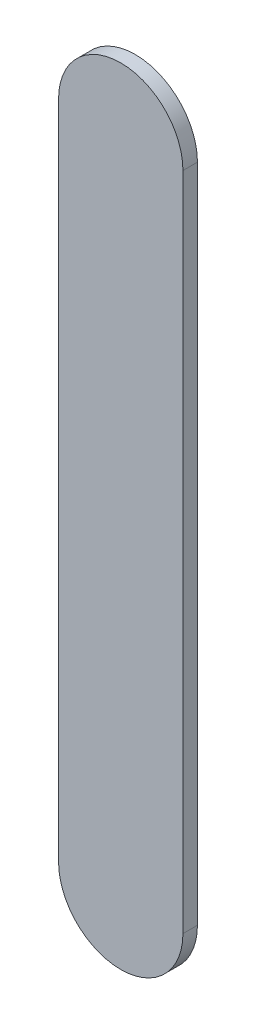
ISO-10303-21;
HEADER;
FILE_DESCRIPTION(('STEP AP214'),'2;1');
FILE_NAME('part.step','',(''),(''),'','','');
FILE_SCHEMA(('AUTOMOTIVE_DESIGN { 1 0 10303 214 1 1 1 1 }'));
ENDSEC;
DATA;
#1=APPLICATION_CONTEXT('core data for automotive mechanical design processes');
#2=APPLICATION_PROTOCOL_DEFINITION('international standard','automotive_design',2000,#1);
#3=PRODUCT_CONTEXT('',#1,'mechanical');
#4=PRODUCT('Part','Part','',(#3));
#5=PRODUCT_RELATED_PRODUCT_CATEGORY('part','',(#4));
#6=PRODUCT_DEFINITION_FORMATION('','',#4);
#7=PRODUCT_DEFINITION_CONTEXT('part definition',#1,'design');
#8=PRODUCT_DEFINITION('design','',#6,#7);
#9=PRODUCT_DEFINITION_SHAPE('','',#8);
#10=(LENGTH_UNIT() NAMED_UNIT(*) SI_UNIT(.MILLI.,.METRE.));
#11=(NAMED_UNIT(*) PLANE_ANGLE_UNIT() SI_UNIT($,.RADIAN.));
#12=(NAMED_UNIT(*) SI_UNIT($,.STERADIAN.) SOLID_ANGLE_UNIT());
#13=UNCERTAINTY_MEASURE_WITH_UNIT(LENGTH_MEASURE(1.E-05),#10,'distance_accuracy_value','');
#14=(GEOMETRIC_REPRESENTATION_CONTEXT(3) GLOBAL_UNCERTAINTY_ASSIGNED_CONTEXT((#13)) GLOBAL_UNIT_ASSIGNED_CONTEXT((#10,
#11,#12)) REPRESENTATION_CONTEXT('',''));
#15=CARTESIAN_POINT('',(0.,0.,0.));
#16=DIRECTION('',(0.,0.,1.));
#17=DIRECTION('',(1.,0.,0.));
#18=AXIS2_PLACEMENT_3D('',#15,#16,#17);
#19=CARTESIAN_POINT('',(130.518,-118.704,1.635));
#20=DIRECTION('',(0.,0.,1.));
#21=DIRECTION('',(1.,0.,0.));
#22=AXIS2_PLACEMENT_3D('',#19,#20,#21);
#23=PLANE('',#22);
#24=DIRECTION('',(0.,-1.,0.));
#25=VECTOR('',#24,1.);
#26=CARTESIAN_POINT('',(130.518,-118.704,1.635));
#27=LINE('',#26,#25);
#28=CARTESIAN_POINT('',(130.518,-118.704,1.635));
#29=VERTEX_POINT('',#28);
#30=CARTESIAN_POINT('',(130.518,-120.298224,1.635));
#31=VERTEX_POINT('',#30);
#32=EDGE_CURVE('E82',#29,#31,#27,.T.);
#33=ORIENTED_EDGE('',*,*,#32,.T.);
#34=CARTESIAN_POINT('',(130.668,-120.298224,1.635));
#35=DIRECTION('',(0.,0.,1.));
#36=DIRECTION('',(-1.,0.,0.));
#37=AXIS2_PLACEMENT_3D('',#34,#35,#36);
#38=CIRCLE('',#37,0.15);
#39=CARTESIAN_POINT('',(130.818,-120.298224,1.635));
#40=VERTEX_POINT('',#39);
#41=EDGE_CURVE('E101',#31,#40,#38,.T.);
#42=ORIENTED_EDGE('',*,*,#41,.T.);
#43=DIRECTION('',(0.,1.,0.));
#44=VECTOR('',#43,1.);
#45=CARTESIAN_POINT('',(130.818,-120.298224,1.635));
#46=LINE('',#45,#44);
#47=CARTESIAN_POINT('',(130.818,-118.704,1.635));
#48=VERTEX_POINT('',#47);
#49=EDGE_CURVE('E75',#40,#48,#46,.T.);
#50=ORIENTED_EDGE('',*,*,#49,.T.);
#51=CARTESIAN_POINT('',(130.668,-118.704,1.635));
#52=DIRECTION('',(0.,0.,1.));
#53=DIRECTION('',(1.,0.,0.));
#54=AXIS2_PLACEMENT_3D('',#51,#52,#53);
#55=CIRCLE('',#54,0.15);
#56=EDGE_CURVE('E11',#48,#29,#55,.T.);
#57=ORIENTED_EDGE('',*,*,#56,.T.);
#58=EDGE_LOOP('',(#33,#42,#50,#57));
#59=FACE_BOUND('',#58,.T.);
#60=ADVANCED_FACE('F17',(#59),#23,.T.);
#61=CARTESIAN_POINT('',(130.518,-118.704,1.6));
#62=DIRECTION('',(0.,0.,1.));
#63=DIRECTION('',(1.,0.,0.));
#64=AXIS2_PLACEMENT_3D('',#61,#62,#63);
#65=PLANE('',#64);
#66=CARTESIAN_POINT('',(130.668,-118.704,1.6));
#67=DIRECTION('',(0.,0.,1.));
#68=DIRECTION('',(1.,0.,0.));
#69=AXIS2_PLACEMENT_3D('',#66,#67,#68);
#70=CIRCLE('',#69,0.15);
#71=CARTESIAN_POINT('',(130.818,-118.704,1.6));
#72=VERTEX_POINT('',#71);
#73=CARTESIAN_POINT('',(130.518,-118.704,1.6));
#74=VERTEX_POINT('',#73);
#75=EDGE_CURVE('E20',#72,#74,#70,.T.);
#76=ORIENTED_EDGE('',*,*,#75,.F.);
#77=DIRECTION('',(0.,1.,0.));
#78=VECTOR('',#77,1.);
#79=CARTESIAN_POINT('',(130.818,-120.298224,1.6));
#80=LINE('',#79,#78);
#81=CARTESIAN_POINT('',(130.818,-120.298224,1.6));
#82=VERTEX_POINT('',#81);
#83=EDGE_CURVE('E109',#82,#72,#80,.T.);
#84=ORIENTED_EDGE('',*,*,#83,.F.);
#85=CARTESIAN_POINT('',(130.668,-120.298224,1.6));
#86=DIRECTION('',(0.,0.,1.));
#87=DIRECTION('',(-1.,0.,0.));
#88=AXIS2_PLACEMENT_3D('',#85,#86,#87);
#89=CIRCLE('',#88,0.15);
#90=CARTESIAN_POINT('',(130.518,-120.298224,1.6));
#91=VERTEX_POINT('',#90);
#92=EDGE_CURVE('E84',#91,#82,#89,.T.);
#93=ORIENTED_EDGE('',*,*,#92,.F.);
#94=DIRECTION('',(0.,-1.,0.));
#95=VECTOR('',#94,1.);
#96=CARTESIAN_POINT('',(130.518,-118.704,1.6));
#97=LINE('',#96,#95);
#98=EDGE_CURVE('E80',#74,#91,#97,.T.);
#99=ORIENTED_EDGE('',*,*,#98,.F.);
#100=EDGE_LOOP('',(#76,#84,#93,#99));
#101=FACE_BOUND('',#100,.T.);
#102=ADVANCED_FACE('F86',(#101),#65,.F.);
#103=CARTESIAN_POINT('',(130.668,-118.704,1.6));
#104=DIRECTION('',(0.,0.,-1.));
#105=DIRECTION('',(1.,0.,0.));
#106=AXIS2_PLACEMENT_3D('',#103,#104,#105);
#107=CYLINDRICAL_SURFACE('',#106,0.15);
#108=ORIENTED_EDGE('',*,*,#75,.T.);
#109=DIRECTION('',(0.,0.,1.));
#110=VECTOR('',#109,1.);
#111=CARTESIAN_POINT('',(130.518,-118.704,1.6));
#112=LINE('',#111,#110);
#113=EDGE_CURVE('E69',#74,#29,#112,.T.);
#114=ORIENTED_EDGE('',*,*,#113,.T.);
#115=ORIENTED_EDGE('',*,*,#56,.F.);
#116=DIRECTION('',(0.,0.,1.));
#117=VECTOR('',#116,1.);
#118=CARTESIAN_POINT('',(130.818,-118.704,1.6));
#119=LINE('',#118,#117);
#120=EDGE_CURVE('E72',#72,#48,#119,.T.);
#121=ORIENTED_EDGE('',*,*,#120,.F.);
#122=EDGE_LOOP('',(#108,#114,#115,#121));
#123=FACE_BOUND('',#122,.T.);
#124=ADVANCED_FACE('F68',(#123),#107,.T.);
#125=CARTESIAN_POINT('',(130.818,-120.298224,1.6));
#126=DIRECTION('',(-1.,0.,0.));
#127=DIRECTION('',(0.,0.,1.));
#128=AXIS2_PLACEMENT_3D('',#125,#126,#127);
#129=PLANE('',#128);
#130=ORIENTED_EDGE('',*,*,#83,.T.);
#131=ORIENTED_EDGE('',*,*,#120,.T.);
#132=ORIENTED_EDGE('',*,*,#49,.F.);
#133=DIRECTION('',(0.,0.,1.));
#134=VECTOR('',#133,1.);
#135=CARTESIAN_POINT('',(130.818,-120.298224,1.6));
#136=LINE('',#135,#134);
#137=EDGE_CURVE('E98',#82,#40,#136,.T.);
#138=ORIENTED_EDGE('',*,*,#137,.F.);
#139=EDGE_LOOP('',(#130,#131,#132,#138));
#140=FACE_BOUND('',#139,.T.);
#141=ADVANCED_FACE('F120',(#140),#129,.F.);
#142=CARTESIAN_POINT('',(130.668,-120.298224,1.6));
#143=DIRECTION('',(0.,0.,-1.));
#144=DIRECTION('',(-1.,0.,0.));
#145=AXIS2_PLACEMENT_3D('',#142,#143,#144);
#146=CYLINDRICAL_SURFACE('',#145,0.15);
#147=ORIENTED_EDGE('',*,*,#92,.T.);
#148=ORIENTED_EDGE('',*,*,#137,.T.);
#149=ORIENTED_EDGE('',*,*,#41,.F.);
#150=DIRECTION('',(0.,0.,1.));
#151=VECTOR('',#150,1.);
#152=CARTESIAN_POINT('',(130.518,-120.298224,1.6));
#153=LINE('',#152,#151);
#154=EDGE_CURVE('E90',#91,#31,#153,.T.);
#155=ORIENTED_EDGE('',*,*,#154,.F.);
#156=EDGE_LOOP('',(#147,#148,#149,#155));
#157=FACE_BOUND('',#156,.T.);
#158=ADVANCED_FACE('F122',(#157),#146,.T.);
#159=CARTESIAN_POINT('',(130.518,-118.704,1.6));
#160=DIRECTION('',(1.,0.,0.));
#161=DIRECTION('',(0.,1.,0.));
#162=AXIS2_PLACEMENT_3D('',#159,#160,#161);
#163=PLANE('',#162);
#164=ORIENTED_EDGE('',*,*,#98,.T.);
#165=ORIENTED_EDGE('',*,*,#154,.T.);
#166=ORIENTED_EDGE('',*,*,#32,.F.);
#167=ORIENTED_EDGE('',*,*,#113,.F.);
#168=EDGE_LOOP('',(#164,#165,#166,#167));
#169=FACE_BOUND('',#168,.T.);
#170=ADVANCED_FACE('F78',(#169),#163,.F.);
#171=CLOSED_SHELL('',(#60,#102,#124,#141,#158,#170));
#172=MANIFOLD_SOLID_BREP('B1',#171);
#173=ADVANCED_BREP_SHAPE_REPRESENTATION('',(#18,#172),#14);
#174=SHAPE_DEFINITION_REPRESENTATION(#9,#173);
ENDSEC;
END-ISO-10303-21;
